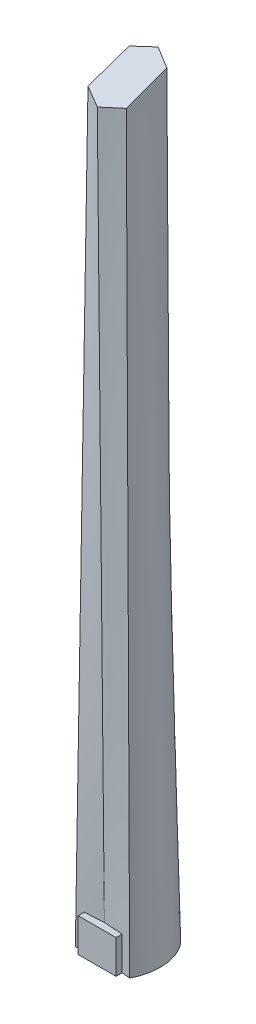
ISO-10303-21;
HEADER;
FILE_DESCRIPTION(('STEP AP214'),'2;1');
FILE_NAME('part.step','',(''),(''),'','','');
FILE_SCHEMA(('AUTOMOTIVE_DESIGN { 1 0 10303 214 1 1 1 1 }'));
ENDSEC;
DATA;
#1=APPLICATION_CONTEXT('core data for automotive mechanical design processes');
#2=APPLICATION_PROTOCOL_DEFINITION('international standard','automotive_design',2000,#1);
#3=PRODUCT_CONTEXT('',#1,'mechanical');
#4=PRODUCT('Part','Part','',(#3));
#5=PRODUCT_RELATED_PRODUCT_CATEGORY('part','',(#4));
#6=PRODUCT_DEFINITION_FORMATION('','',#4);
#7=PRODUCT_DEFINITION_CONTEXT('part definition',#1,'design');
#8=PRODUCT_DEFINITION('design','',#6,#7);
#9=PRODUCT_DEFINITION_SHAPE('','',#8);
#10=(LENGTH_UNIT() NAMED_UNIT(*) SI_UNIT(.MILLI.,.METRE.));
#11=(NAMED_UNIT(*) PLANE_ANGLE_UNIT() SI_UNIT($,.RADIAN.));
#12=(NAMED_UNIT(*) SI_UNIT($,.STERADIAN.) SOLID_ANGLE_UNIT());
#13=UNCERTAINTY_MEASURE_WITH_UNIT(LENGTH_MEASURE(1.E-05),#10,'distance_accuracy_value','');
#14=(GEOMETRIC_REPRESENTATION_CONTEXT(3) GLOBAL_UNCERTAINTY_ASSIGNED_CONTEXT((#13)) GLOBAL_UNIT_ASSIGNED_CONTEXT((#10,
#11,#12)) REPRESENTATION_CONTEXT('',''));
#15=CARTESIAN_POINT('',(0.,0.,0.));
#16=DIRECTION('',(0.,0.,1.));
#17=DIRECTION('',(1.,0.,0.));
#18=AXIS2_PLACEMENT_3D('',#15,#16,#17);
#19=CARTESIAN_POINT('',(3.5,3.1,-18.2));
#20=DIRECTION('',(0.,0.,-1.));
#21=DIRECTION('',(-1.,0.,0.));
#22=AXIS2_PLACEMENT_3D('',#19,#20,#21);
#23=PLANE('',#22);
#24=DIRECTION('',(0.,-1.,0.));
#25=VECTOR('',#24,1.);
#26=CARTESIAN_POINT('',(-3.5,3.1,-18.2));
#27=LINE('',#26,#25);
#28=CARTESIAN_POINT('',(-3.5,3.1,-18.2));
#29=VERTEX_POINT('',#28);
#30=CARTESIAN_POINT('',(-3.5,-3.1,-18.2));
#31=VERTEX_POINT('',#30);
#32=EDGE_CURVE('E226',#29,#31,#27,.T.);
#33=ORIENTED_EDGE('',*,*,#32,.T.);
#34=DIRECTION('',(-1.,0.,0.));
#35=VECTOR('',#34,1.);
#36=CARTESIAN_POINT('',(3.5,-3.1,-18.2));
#37=LINE('',#36,#35);
#38=CARTESIAN_POINT('',(3.5,-3.1,-18.2));
#39=VERTEX_POINT('',#38);
#40=EDGE_CURVE('E440',#39,#31,#37,.T.);
#41=ORIENTED_EDGE('',*,*,#40,.F.);
#42=DIRECTION('',(0.,-1.,0.));
#43=VECTOR('',#42,1.);
#44=CARTESIAN_POINT('',(3.5,3.1,-18.2));
#45=LINE('',#44,#43);
#46=CARTESIAN_POINT('',(3.5,3.1,-18.2));
#47=VERTEX_POINT('',#46);
#48=EDGE_CURVE('E227',#47,#39,#45,.T.);
#49=ORIENTED_EDGE('',*,*,#48,.F.);
#50=DIRECTION('',(-1.,0.,0.));
#51=VECTOR('',#50,1.);
#52=CARTESIAN_POINT('',(3.5,3.1,-18.2));
#53=LINE('',#52,#51);
#54=EDGE_CURVE('E442',#47,#29,#53,.T.);
#55=ORIENTED_EDGE('',*,*,#54,.T.);
#56=EDGE_LOOP('',(#33,#41,#49,#55));
#57=FACE_BOUND('',#56,.T.);
#58=ADVANCED_FACE('F57',(#57),#23,.F.);
#59=CARTESIAN_POINT('',(3.5,-3.1,-18.2));
#60=DIRECTION('',(0.,1.,0.));
#61=DIRECTION('',(0.,0.,1.));
#62=AXIS2_PLACEMENT_3D('',#59,#60,#61);
#63=PLANE('',#62);
#64=DIRECTION('',(0.,0.,-1.));
#65=VECTOR('',#64,1.);
#66=CARTESIAN_POINT('',(-3.5,-3.1,-18.2));
#67=LINE('',#66,#65);
#68=CARTESIAN_POINT('',(-3.5,-3.1,-19.321786953521));
#69=VERTEX_POINT('',#68);
#70=EDGE_CURVE('E444',#31,#69,#67,.T.);
#71=ORIENTED_EDGE('',*,*,#70,.T.);
#72=DIRECTION('',(-0.996767792058397,0.,0.0803365963619861));
#73=VECTOR('',#72,1.);
#74=CARTESIAN_POINT('',(0.,-3.1,-19.6038768138749));
#75=LINE('',#74,#73);
#76=CARTESIAN_POINT('',(-5.01105869877265,-3.1,-19.2000000000001));
#77=VERTEX_POINT('',#76);
#78=EDGE_CURVE('E285',#69,#77,#75,.T.);
#79=ORIENTED_EDGE('',*,*,#78,.T.);
#80=CARTESIAN_POINT('',(0.,-3.1,-23.7));
#81=DIRECTION('',(0.,-1.,0.));
#82=DIRECTION('',(0.,0.,-1.));
#83=AXIS2_PLACEMENT_3D('',#80,#81,#82);
#84=ELLIPSE('',#83,7.8,6.135);
#85=CARTESIAN_POINT('',(-0.5,-3.09999999999999,-31.4740523249535));
#86=VERTEX_POINT('',#85);
#87=EDGE_CURVE('E295',#77,#86,#84,.T.);
#88=ORIENTED_EDGE('',*,*,#87,.T.);
#89=DIRECTION('',(0.969708502165906,0.,-0.244265062641292));
#90=VECTOR('',#89,1.);
#91=CARTESIAN_POINT('',(0.,-3.09999999999999,-31.6));
#92=LINE('',#91,#90);
#93=CARTESIAN_POINT('',(0.,-3.09999999999999,-31.6));
#94=VERTEX_POINT('',#93);
#95=EDGE_CURVE('E298',#86,#94,#92,.T.);
#96=ORIENTED_EDGE('',*,*,#95,.T.);
#97=DIRECTION('',(0.969708502165906,0.,0.244265062641292));
#98=VECTOR('',#97,1.);
#99=CARTESIAN_POINT('',(0.5,-3.09999999999999,-31.4740523249535));
#100=LINE('',#99,#98);
#101=CARTESIAN_POINT('',(0.5,-3.09999999999999,-31.4740523249535));
#102=VERTEX_POINT('',#101);
#103=EDGE_CURVE('E287',#94,#102,#100,.T.);
#104=ORIENTED_EDGE('',*,*,#103,.T.);
#105=CARTESIAN_POINT('',(0.,-3.1,-23.7));
#106=DIRECTION('',(0.,-1.,0.));
#107=DIRECTION('',(0.,0.,-1.));
#108=AXIS2_PLACEMENT_3D('',#105,#106,#107);
#109=ELLIPSE('',#108,7.8,6.135);
#110=CARTESIAN_POINT('',(5.01105869877264,-3.1,-19.2000000000001));
#111=VERTEX_POINT('',#110);
#112=EDGE_CURVE('E273',#102,#111,#109,.T.);
#113=ORIENTED_EDGE('',*,*,#112,.T.);
#114=DIRECTION('',(-0.996767792058396,0.,-0.0803365963619911));
#115=VECTOR('',#114,1.);
#116=CARTESIAN_POINT('',(5.01105869877264,-3.1,-19.2000000000001));
#117=LINE('',#116,#115);
#118=CARTESIAN_POINT('',(3.5,-3.1,-19.321786953521));
#119=VERTEX_POINT('',#118);
#120=EDGE_CURVE('E182',#111,#119,#117,.T.);
#121=ORIENTED_EDGE('',*,*,#120,.T.);
#122=DIRECTION('',(0.,0.,-1.));
#123=VECTOR('',#122,1.);
#124=CARTESIAN_POINT('',(3.5,-3.1,-18.2));
#125=LINE('',#124,#123);
#126=EDGE_CURVE('E283',#39,#119,#125,.T.);
#127=ORIENTED_EDGE('',*,*,#126,.F.);
#128=ORIENTED_EDGE('',*,*,#40,.T.);
#129=EDGE_LOOP('',(#71,#79,#88,#96,#104,#113,#121,#127,#128));
#130=FACE_BOUND('',#129,.T.);
#131=ADVANCED_FACE('F232',(#130),#63,.F.);
#132=CARTESIAN_POINT('',(3.5,3.1,-18.2));
#133=DIRECTION('',(0.,-1.,0.));
#134=DIRECTION('',(0.,0.,-1.));
#135=AXIS2_PLACEMENT_3D('',#132,#133,#134);
#136=PLANE('',#135);
#137=CARTESIAN_POINT('',(3.5,3.1,-19.3271864966014));
#138=CARTESIAN_POINT('',(3.08184621308798,3.1,-19.3528787017063));
#139=CARTESIAN_POINT('',(2.66369242617595,3.1,-19.3785709068112));
#140=CARTESIAN_POINT('',(1.49702575950929,3.1,-19.4502532405057));
#141=CARTESIAN_POINT('',(0.748512879754643,3.1,-19.4962433690953));
#142=CARTESIAN_POINT('',(0.,3.1,-19.5422334976849));
#143=B_SPLINE_CURVE_WITH_KNOTS('',3,(#137,#138,#139,#140,#141,#142),.UNSPECIFIED.,.F.,.F.,(4,2,
4),(0.,1.25682700090671,3.50660023565205),.UNSPECIFIED.);
#144=CARTESIAN_POINT('',(3.5,3.1,-19.3271864966014));
#145=VERTEX_POINT('',#144);
#146=CARTESIAN_POINT('',(0.,3.10000000000001,-19.5422334976849));
#147=VERTEX_POINT('',#146);
#148=EDGE_CURVE('E80',#145,#147,#143,.T.);
#149=ORIENTED_EDGE('',*,*,#148,.T.);
#150=CARTESIAN_POINT('',(0.,3.10000000000001,-19.5422334976849));
#151=CARTESIAN_POINT('',(-0.418153786912024,3.1,-19.51654129258));
#152=CARTESIAN_POINT('',(-0.836307573824049,3.1,-19.4908490874751));
#153=CARTESIAN_POINT('',(-2.00297424049072,3.1,-19.4191667537806));
#154=CARTESIAN_POINT('',(-2.75148712024536,3.1,-19.373176625191));
#155=CARTESIAN_POINT('',(-3.5,3.1,-19.3271864966014));
#156=B_SPLINE_CURVE_WITH_KNOTS('',3,(#150,#151,#152,#153,#154,#155),.UNSPECIFIED.,.F.,.F.,(4,2,
4),(0.,1.25682700090672,3.50660023565205),.UNSPECIFIED.);
#157=CARTESIAN_POINT('',(-3.5,3.1,-19.3271864966014));
#158=VERTEX_POINT('',#157);
#159=EDGE_CURVE('E156',#147,#158,#156,.T.);
#160=ORIENTED_EDGE('',*,*,#159,.T.);
#161=DIRECTION('',(0.,0.,1.));
#162=VECTOR('',#161,1.);
#163=CARTESIAN_POINT('',(-3.5,3.1,-18.2));
#164=LINE('',#163,#162);
#165=EDGE_CURVE('E446',#158,#29,#164,.T.);
#166=ORIENTED_EDGE('',*,*,#165,.T.);
#167=ORIENTED_EDGE('',*,*,#54,.F.);
#168=DIRECTION('',(0.,0.,1.));
#169=VECTOR('',#168,1.);
#170=CARTESIAN_POINT('',(3.5,3.1,-18.2));
#171=LINE('',#170,#169);
#172=EDGE_CURVE('E450',#145,#47,#171,.T.);
#173=ORIENTED_EDGE('',*,*,#172,.F.);
#174=EDGE_LOOP('',(#149,#160,#166,#167,#173));
#175=FACE_BOUND('',#174,.T.);
#176=ADVANCED_FACE('F229',(#175),#136,.F.);
#177=CARTESIAN_POINT('',(3.5,0.,-23.7));
#178=DIRECTION('',(-1.,0.,0.));
#179=DIRECTION('',(0.,0.,1.));
#180=AXIS2_PLACEMENT_3D('',#177,#178,#179);
#181=PLANE('',#180);
#182=ORIENTED_EDGE('',*,*,#126,.T.);
#183=CARTESIAN_POINT('',(3.5,-3.1,-19.321786953521));
#184=CARTESIAN_POINT('',(3.5,-2.06666653696074,-19.3225379431415));
#185=CARTESIAN_POINT('',(3.5,-1.03333313877444,-19.3233633998751));
#186=CARTESIAN_POINT('',(3.5,1.03333352789223,-19.3251632475686));
#187=CARTESIAN_POINT('',(3.5,2.0666667963726,-19.3261376385284));
#188=CARTESIAN_POINT('',(3.5,3.1,-19.3271864966014));
#189=B_SPLINE_CURVE_WITH_KNOTS('',3,(#183,#184,#185,#186,#187,#188),.UNSPECIFIED.,.F.,.F.,(4,2,
4),(0.,3.10000118365696,6.20000236731393),.UNSPECIFIED.);
#190=EDGE_CURVE('E66',#119,#145,#189,.T.);
#191=ORIENTED_EDGE('',*,*,#190,.T.);
#192=ORIENTED_EDGE('',*,*,#172,.T.);
#193=ORIENTED_EDGE('',*,*,#48,.T.);
#194=EDGE_LOOP('',(#182,#191,#192,#193));
#195=FACE_BOUND('',#194,.T.);
#196=ADVANCED_FACE('F202',(#195),#181,.F.);
#197=CARTESIAN_POINT('',(-3.5,0.,-23.7));
#198=DIRECTION('',(-1.,0.,0.));
#199=DIRECTION('',(0.,0.,1.));
#200=AXIS2_PLACEMENT_3D('',#197,#198,#199);
#201=PLANE('',#200);
#202=CARTESIAN_POINT('',(-3.5,-3.1,-19.321786953521));
#203=CARTESIAN_POINT('',(-3.5,-2.06666653696074,-19.3225379431415));
#204=CARTESIAN_POINT('',(-3.5,-1.03333313877444,-19.3233633998751));
#205=CARTESIAN_POINT('',(-3.5,1.03333352789223,-19.3251632475686));
#206=CARTESIAN_POINT('',(-3.5,2.0666667963726,-19.3261376385284));
#207=CARTESIAN_POINT('',(-3.5,3.1,-19.3271864966014));
#208=B_SPLINE_CURVE_WITH_KNOTS('',3,(#202,#203,#204,#205,#206,#207),.UNSPECIFIED.,.F.,.F.,(4,2,
4),(0.,3.10000118365696,6.20000236731393),.UNSPECIFIED.);
#209=EDGE_CURVE('E456',#69,#158,#208,.T.);
#210=ORIENTED_EDGE('',*,*,#209,.F.);
#211=ORIENTED_EDGE('',*,*,#70,.F.);
#212=ORIENTED_EDGE('',*,*,#32,.F.);
#213=ORIENTED_EDGE('',*,*,#165,.F.);
#214=EDGE_LOOP('',(#210,#211,#212,#213));
#215=FACE_BOUND('',#214,.T.);
#216=ADVANCED_FACE('F197',(#215),#201,.T.);
#217=CARTESIAN_POINT('',(0.,-3.1,-19.6038768138749));
#218=CARTESIAN_POINT('',(0.,138.1,-18.2000000000001));
#219=CARTESIAN_POINT('',(0.83517644979544,-3.1,-19.5365640115624));
#220=CARTESIAN_POINT('',(0.583333333333336,138.1,-18.5125000000001));
#221=CARTESIAN_POINT('',(1.67035289959088,-3.1,-19.46925120925));
#222=CARTESIAN_POINT('',(1.16666666666667,138.1,-18.8250000000001));
#223=CARTESIAN_POINT('',(3.34070579918176,-3.1,-19.334625604625));
#224=CARTESIAN_POINT('',(2.33333333333334,138.1,-19.4500000000001));
#225=CARTESIAN_POINT('',(4.1758822489772,-3.1,-19.2673128023126));
#226=CARTESIAN_POINT('',(2.91666666666667,138.1,-19.7625000000001));
#227=CARTESIAN_POINT('',(5.01105869877264,-3.1,-19.2000000000001));
#228=CARTESIAN_POINT('',(3.5,138.1,-20.0750000000001));
#229=B_SPLINE_SURFACE_WITH_KNOTS('',3,1,((#217,#218),(#219,#220),(#221,#222),(#223,#224),(#225,
#226),(#227,#228)),.UNSPECIFIED.,.F.,.F.,.F.,(4,2,4),(2,2),(0.,0.5,1.),(0.,1.),.UNSPECIFIED.);
#230=CARTESIAN_POINT('',(0.,134.1,-18.239769881413));
#231=CARTESIAN_POINT('',(0.368528414141569,134.16696005857,-18.4274292977448));
#232=CARTESIAN_POINT('',(0.736857004116908,134.234044345406,-18.6154368709364));
#233=CARTESIAN_POINT('',(1.5106251836083,134.375311580376,-19.0113464239956));
#234=CARTESIAN_POINT('',(1.91602155819805,134.449521262535,-19.2193233275032));
#235=CARTESIAN_POINT('',(2.72632123716101,134.598245642812,-19.6361319592883));
#236=CARTESIAN_POINT('',(3.13122453906086,134.672760342451,-19.8449636918311));
#237=CARTESIAN_POINT('',(3.53587771151628,134.747428144113,-20.0542245016014));
#238=B_SPLINE_CURVE_WITH_KNOTS('',3,(#230,#231,#232,#233,#234,#235,#236,#237),.UNSPECIFIED.,.F.,
.F.,(4,2,2,4),(0.,1.25682763559584,2.64173413129077,4.02664754561933),.UNSPECIFIED.);
#239=CARTESIAN_POINT('',(0.,134.1,-18.239769881413));
#240=VERTEX_POINT('',#239);
#241=CARTESIAN_POINT('',(3.53587771151628,134.747428144113,-20.0542245016014));
#242=VERTEX_POINT('',#241);
#243=EDGE_CURVE('E137',#240,#242,#238,.T.);
#244=DIRECTION('',(0.,0.999950577305783,0.00994197896954888));
#245=VECTOR('',#244,1.);
#246=CARTESIAN_POINT('',(0.,67.5,-18.9019384069375));
#247=LINE('',#246,#245);
#248=EDGE_CURVE('E149',#147,#240,#247,.T.);
#249=DIRECTION('',(-0.0107007306874032,0.999923546509874,-0.00619641007929271));
#250=VECTOR('',#249,1.);
#251=CARTESIAN_POINT('',(4.25552934938632,67.5,-19.6375000000001));
#252=LINE('',#251,#250);
#253=EDGE_CURVE('E151',#111,#242,#252,.T.);
#254=ORIENTED_EDGE('',*,*,#243,.F.);
#255=ORIENTED_EDGE('',*,*,#248,.F.);
#256=ORIENTED_EDGE('',*,*,#148,.F.);
#257=ORIENTED_EDGE('',*,*,#190,.F.);
#258=ORIENTED_EDGE('',*,*,#120,.F.);
#259=ORIENTED_EDGE('',*,*,#253,.T.);
#260=EDGE_LOOP('',(#254,#255,#256,#257,#258,#259));
#261=FACE_BOUND('',#260,.T.);
#262=ADVANCED_FACE('F148',(#261),#229,.T.);
#263=CARTESIAN_POINT('',(-5.01105869877265,-3.1,-19.2000000000001));
#264=CARTESIAN_POINT('',(-3.5,138.1,-20.0750000000001));
#265=CARTESIAN_POINT('',(-4.17588224897721,-3.1,-19.2673128023126));
#266=CARTESIAN_POINT('',(-2.91666666666667,138.1,-19.7625000000001));
#267=CARTESIAN_POINT('',(-3.34070579918177,-3.1,-19.334625604625));
#268=CARTESIAN_POINT('',(-2.33333333333334,138.1,-19.4500000000001));
#269=CARTESIAN_POINT('',(-1.67035289959089,-3.1,-19.46925120925));
#270=CARTESIAN_POINT('',(-1.16666666666668,138.1,-18.8250000000001));
#271=CARTESIAN_POINT('',(-0.835176449795443,-3.1,-19.5365640115624));
#272=CARTESIAN_POINT('',(-0.58333333333334,138.1,-18.5125000000001));
#273=CARTESIAN_POINT('',(0.,-3.1,-19.6038768138749));
#274=CARTESIAN_POINT('',(0.,138.1,-18.2000000000001));
#275=B_SPLINE_SURFACE_WITH_KNOTS('',3,1,((#263,#264),(#265,#266),(#267,#268),(#269,#270),(#271,
#272),(#273,#274)),.UNSPECIFIED.,.F.,.F.,.F.,(4,2,4),(2,2),(0.,0.5,1.),(0.,1.),.UNSPECIFIED.);
#276=CARTESIAN_POINT('',(-3.53587771151628,134.747428144113,-20.0542245016014));
#277=CARTESIAN_POINT('',(-3.16864950578684,134.679666107722,-19.8643174962891));
#278=CARTESIAN_POINT('',(-2.8012152904957,134.612030162157,-19.6747638677712));
#279=CARTESIAN_POINT('',(-2.02847398200534,134.470129539642,-19.2770792096803));
#280=CARTESIAN_POINT('',(-1.62312317525491,134.395891746474,-19.0690235234543));
#281=CARTESIAN_POINT('',(-0.811929125169262,134.247719021931,-18.6537609385971));
#282=CARTESIAN_POINT('',(-0.406085879401792,134.173784092059,-18.4465540441806));
#283=CARTESIAN_POINT('',(0.,134.1,-18.239769881413));
#284=B_SPLINE_CURVE_WITH_KNOTS('',3,(#276,#277,#278,#279,#280,#281,#282,#283),.UNSPECIFIED.,.F.,
.F.,(4,2,2,4),(0.,1.25682765441886,2.64173416640638,4.02664754678678),.UNSPECIFIED.);
#285=CARTESIAN_POINT('',(-3.53587771151628,134.747428144113,-20.0542245016014));
#286=VERTEX_POINT('',#285);
#287=EDGE_CURVE('E134',#286,#240,#284,.T.);
#288=DIRECTION('',(0.0107007306874033,0.999923546509874,-0.00619641007929261));
#289=VECTOR('',#288,1.);
#290=CARTESIAN_POINT('',(-4.25552934938632,67.5,-19.6375000000001));
#291=LINE('',#290,#289);
#292=EDGE_CURVE('E157',#77,#286,#291,.T.);
#293=ORIENTED_EDGE('',*,*,#287,.F.);
#294=ORIENTED_EDGE('',*,*,#292,.F.);
#295=ORIENTED_EDGE('',*,*,#78,.F.);
#296=ORIENTED_EDGE('',*,*,#209,.T.);
#297=ORIENTED_EDGE('',*,*,#159,.F.);
#298=ORIENTED_EDGE('',*,*,#248,.T.);
#299=EDGE_LOOP('',(#293,#294,#295,#296,#297,#298));
#300=FACE_BOUND('',#299,.T.);
#301=ADVANCED_FACE('F154',(#300),#275,.T.);
#302=CARTESIAN_POINT('',(0.5,-3.09999999999999,-31.4740523249535));
#303=CARTESIAN_POINT('',(3.5,138.1,-27.5750000000001));
#304=CARTESIAN_POINT('',(0.416666666666665,-3.09999999999999,-31.4950436041279));
#305=CARTESIAN_POINT('',(2.91666666666667,138.1,-27.8875000000001));
#306=CARTESIAN_POINT('',(0.333333333333332,-3.09999999999999,-31.5160348833023));
#307=CARTESIAN_POINT('',(2.33333333333334,138.1,-28.2000000000001));
#308=CARTESIAN_POINT('',(0.166666666666666,-3.09999999999999,-31.5580174416512));
#309=CARTESIAN_POINT('',(1.16666666666667,138.1,-28.8250000000001));
#310=CARTESIAN_POINT('',(0.0833333333333328,-3.09999999999999,-31.5790087208256));
#311=CARTESIAN_POINT('',(0.583333333333338,138.1,-29.1375000000001));
#312=CARTESIAN_POINT('',(0.,-3.09999999999999,-31.6));
#313=CARTESIAN_POINT('',(0.,138.1,-29.4500000000001));
#314=B_SPLINE_SURFACE_WITH_KNOTS('',3,1,((#302,#303),(#304,#305),(#306,#307),(#308,#309),(#310,
#311),(#312,#313)),.UNSPECIFIED.,.F.,.F.,.F.,(4,2,4),(2,2),(0.,0.5,1.),(0.,1.),.UNSPECIFIED.);
#315=CARTESIAN_POINT('',(3.48592413410357,137.437495911808,-27.5932941792165));
#316=CARTESIAN_POINT('',(3.19540526165819,137.492689608597,-27.7479776897417));
#317=CARTESIAN_POINT('',(2.90489271193011,137.54788706409,-27.9026717342508));
#318=CARTESIAN_POINT('',(2.17862709571426,137.685890073265,-28.2894331067265));
#319=CARTESIAN_POINT('',(1.7428819110457,137.768700311642,-28.5215135638219));
#320=CARTESIAN_POINT('',(0.871419793999645,137.934337580494,-28.9857215388333));
#321=CARTESIAN_POINT('',(0.435702861622529,138.017164610969,-29.2178490567499));
#322=CARTESIAN_POINT('',(0.,138.1,-29.4500000000001));
#323=B_SPLINE_CURVE_WITH_KNOTS('',3,(#315,#316,#317,#318,#319,#320,#321,#322),.UNSPECIFIED.,.F.,
.F.,(4,2,2,4),(0.,1.00118476338147,2.50296192752349,4.00473911143994),.UNSPECIFIED.);
#324=CARTESIAN_POINT('',(3.48592413410357,137.437495911808,-27.5932941792165));
#325=VERTEX_POINT('',#324);
#326=CARTESIAN_POINT('',(0.,138.1,-29.4500000000001));
#327=VERTEX_POINT('',#326);
#328=EDGE_CURVE('E143',#325,#327,#323,.T.);
#329=DIRECTION('',(-0.021233574820975,-0.999393588240558,-0.0275969397575981));
#330=VECTOR('',#329,1.);
#331=CARTESIAN_POINT('',(2.,67.5,-29.5245261624768));
#332=LINE('',#331,#330);
#333=EDGE_CURVE('E60',#325,#102,#332,.T.);
#334=DIRECTION('',(0.,0.999884095040298,0.015224864053375));
#335=VECTOR('',#334,1.);
#336=CARTESIAN_POINT('',(0.,67.5,-30.525));
#337=LINE('',#336,#335);
#338=EDGE_CURVE('E316',#94,#327,#337,.T.);
#339=ORIENTED_EDGE('',*,*,#328,.F.);
#340=ORIENTED_EDGE('',*,*,#333,.T.);
#341=ORIENTED_EDGE('',*,*,#103,.F.);
#342=ORIENTED_EDGE('',*,*,#338,.T.);
#343=EDGE_LOOP('',(#339,#340,#341,#342));
#344=FACE_BOUND('',#343,.T.);
#345=ADVANCED_FACE('F359',(#344),#314,.T.);
#346=CARTESIAN_POINT('',(0.,-3.09999999999999,-31.6));
#347=CARTESIAN_POINT('',(0.,138.1,-29.4500000000001));
#348=CARTESIAN_POINT('',(-0.0833333333333346,-3.09999999999999,-31.5790087208256));
#349=CARTESIAN_POINT('',(-0.583333333333326,138.1,-29.1375000000001));
#350=CARTESIAN_POINT('',(-0.166666666666669,-3.09999999999999,-31.5580174416512));
#351=CARTESIAN_POINT('',(-1.16666666666666,138.1,-28.8250000000001));
#352=CARTESIAN_POINT('',(-0.333333333333336,-3.09999999999999,-31.5160348833023));
#353=CARTESIAN_POINT('',(-2.33333333333332,138.1,-28.2000000000001));
#354=CARTESIAN_POINT('',(-0.416666666666668,-3.09999999999999,-31.4950436041279));
#355=CARTESIAN_POINT('',(-2.91666666666666,138.1,-27.8875000000001));
#356=CARTESIAN_POINT('',(-0.5,-3.09999999999999,-31.4740523249535));
#357=CARTESIAN_POINT('',(-3.5,138.1,-27.5750000000001));
#358=B_SPLINE_SURFACE_WITH_KNOTS('',3,1,((#346,#347),(#348,#349),(#350,#351),(#352,#353),(#354,
#355),(#356,#357)),.UNSPECIFIED.,.F.,.F.,.F.,(4,2,4),(2,2),(0.,0.5,1.),(0.,1.),.UNSPECIFIED.);
#359=CARTESIAN_POINT('',(0.,138.1,-29.4500000000001));
#360=CARTESIAN_POINT('',(-0.580937135994762,137.989552817116,-29.1404654159803));
#361=CARTESIAN_POINT('',(-1.16189928579996,137.879120493991,-28.8309724772909));
#362=CARTESIAN_POINT('',(-2.03338024556787,137.713494429022,-28.3667959018055));
#363=CARTESIAN_POINT('',(-2.32388019107855,137.658289476734,-28.2120808470963));
#364=CARTESIAN_POINT('',(-2.90489269481088,137.547887067337,-27.9026717433489));
#365=CARTESIAN_POINT('',(-3.19540525303259,137.492689610228,-27.7479776943108));
#366=CARTESIAN_POINT('',(-3.48592413410357,137.437495911808,-27.5932941792165));
#367=B_SPLINE_CURVE_WITH_KNOTS('',3,(#359,#360,#361,#362,#363,#364,#365,#366),.UNSPECIFIED.,.F.,
.F.,(4,2,2,4),(0.,2.00236953128496,3.00355431814241,4.00473911089565),.UNSPECIFIED.);
#368=CARTESIAN_POINT('',(-3.48592413410357,137.437495911808,-27.5932941792165));
#369=VERTEX_POINT('',#368);
#370=EDGE_CURVE('E72',#327,#369,#367,.T.);
#371=DIRECTION('',(-0.021233574820975,0.999393588240558,0.0275969397575981));
#372=VECTOR('',#371,1.);
#373=CARTESIAN_POINT('',(-2.,67.5,-29.5245261624768));
#374=LINE('',#373,#372);
#375=EDGE_CURVE('E160',#86,#369,#374,.T.);
#376=ORIENTED_EDGE('',*,*,#370,.F.);
#377=ORIENTED_EDGE('',*,*,#338,.F.);
#378=ORIENTED_EDGE('',*,*,#95,.F.);
#379=ORIENTED_EDGE('',*,*,#375,.T.);
#380=EDGE_LOOP('',(#376,#377,#378,#379));
#381=FACE_BOUND('',#380,.T.);
#382=ADVANCED_FACE('F314',(#381),#358,.T.);
#383=CARTESIAN_POINT('',(5.01105869877264,-3.1,-19.2000000000001));
#384=CARTESIAN_POINT('',(3.5,138.1,-20.0750000000001));
#385=CARTESIAN_POINT('',(5.26721176144796,-3.1,-19.6610803353587));
#386=CARTESIAN_POINT('',(3.5,138.1,-20.3875000000001));
#387=CARTESIAN_POINT('',(5.500517699996,-3.1,-20.1877362540474));
#388=CARTESIAN_POINT('',(3.5,138.1,-20.7000000000001));
#389=CARTESIAN_POINT('',(5.87467943936492,-3.1,-21.3641584012241));
#390=CARTESIAN_POINT('',(3.5,138.1,-21.3250000000001));
#391=CARTESIAN_POINT('',(6.01497982950319,-3.1,-22.0142490207324));
#392=CARTESIAN_POINT('',(3.5,138.1,-21.6375000000001));
#393=CARTESIAN_POINT('',(6.15471449388442,-3.1,-23.3951203764202));
#394=CARTESIAN_POINT('',(3.5,138.1,-22.2625000000001));
#395=CARTESIAN_POINT('',(6.15339238526736,-3.1,-24.1255683204977));
#396=CARTESIAN_POINT('',(3.5,138.1,-22.5750000000001));
#397=CARTESIAN_POINT('',(5.98096052104243,-3.1,-25.5876622896784));
#398=CARTESIAN_POINT('',(3.5,138.1,-23.2000000000001));
#399=CARTESIAN_POINT('',(5.80946577633657,-3.1,-26.3182011023983));
#400=CARTESIAN_POINT('',(3.5,138.1,-23.5125000000001));
#401=CARTESIAN_POINT('',(5.3068177205364,-3.1,-27.685846471235));
#402=CARTESIAN_POINT('',(3.5,138.1,-24.1375000000001));
#403=CARTESIAN_POINT('',(4.97609244908729,-3.1,-28.3217883825639));
#404=CARTESIAN_POINT('',(3.5,138.1,-24.4500000000001));
#405=CARTESIAN_POINT('',(4.20460362021986,-3.09999999999999,-29.4279899624467));
#406=CARTESIAN_POINT('',(3.5,138.1,-25.0750000000001));
#407=CARTESIAN_POINT('',(3.76475506907411,-3.1,-29.8979147299094));
#408=CARTESIAN_POINT('',(3.5,138.1,-25.3875000000001));
#409=CARTESIAN_POINT('',(2.84199229706693,-3.09999999999999,-30.6475694007451));
#410=CARTESIAN_POINT('',(3.5,138.1,-26.0125000000001));
#411=CARTESIAN_POINT('',(2.35976413219818,-3.09999999999999,-30.9278234472326));
#412=CARTESIAN_POINT('',(3.5,138.1,-26.3250000000001));
#413=CARTESIAN_POINT('',(1.40994848446077,-3.09999999999999,-31.3176868804898));
#414=CARTESIAN_POINT('',(3.5,138.1,-26.9500000000001));
#415=CARTESIAN_POINT('',(0.942521624985577,-3.09999999999999,-31.4280460453352));
#416=CARTESIAN_POINT('',(3.5,138.1,-27.2625000000001));
#417=CARTESIAN_POINT('',(0.499999999999998,-3.09999999999999,-31.4740523249535));
#418=CARTESIAN_POINT('',(3.5,138.1,-27.5750000000001));
#419=B_SPLINE_SURFACE_WITH_KNOTS('',3,1,((#383,#384),(#385,#386),(#387,#388),(#389,#390),(#391,
#392),(#393,#394),(#395,#396),(#397,#398),(#399,#400),(#401,#402),(#403,#404),(#405,#406),(#407,
#408),(#409,#410),(#411,#412),(#413,#414),(#415,#416),(#417,#418)),.UNSPECIFIED.,.F.,.F.,.F.,(4,
2,2,2,2,2,2,2,4),(2,2),(0.,0.125,0.25,0.375,0.5,0.625,0.75,0.875,1.),(0.,1.),.UNSPECIFIED.);
#420=CARTESIAN_POINT('',(3.53587771151628,134.747428144113,-20.0542245016014));
#421=CARTESIAN_POINT('',(3.53885394271208,134.816246294752,-20.2470913278531));
#422=CARTESIAN_POINT('',(3.5413737798236,134.885066840999,-20.43996486793));
#423=CARTESIAN_POINT('',(3.54541089213693,135.022711349252,-20.82572152095));
#424=CARTESIAN_POINT('',(3.5469281655999,135.091535311265,-21.0186046339091));
#425=CARTESIAN_POINT('',(3.54887024429726,135.229176416511,-21.4043517498043));
#426=CARTESIAN_POINT('',(3.54929518634026,135.297993559518,-21.5972157521081));
#427=CARTESIAN_POINT('',(3.54903173577272,135.435627473957,-21.9829427153556));
#428=CARTESIAN_POINT('',(3.54834334487081,135.50444424539,-22.1758056763004));
#429=CARTESIAN_POINT('',(3.54593521762637,135.642076228548,-22.5615272270206));
#430=CARTESIAN_POINT('',(3.54421547312014,135.710891440257,-22.7543858167493));
#431=CARTESIAN_POINT('',(3.53990592285794,135.848518813625,-23.1400944482682));
#432=CARTESIAN_POINT('',(3.53731611540218,135.917330975279,-23.3329444900409));
#433=CARTESIAN_POINT('',(3.53155226101193,136.054954970722,-23.7186436547315));
#434=CARTESIAN_POINT('',(3.52837819252378,136.123766804407,-23.911492777353));
#435=CARTESIAN_POINT('',(3.52178183660672,136.261389193374,-24.2971874398003));
#436=CARTESIAN_POINT('',(3.51835954875494,136.330199748654,-24.4900329796195));
#437=CARTESIAN_POINT('',(3.51077395582181,136.485545573917,-24.9253985919099));
#438=CARTESIAN_POINT('',(3.50664683473051,136.57208105533,-25.1679192569246));
#439=CARTESIAN_POINT('',(3.49924324856312,136.745155835149,-25.6529712842982));
#440=CARTESIAN_POINT('',(3.49596677849985,136.83169513353,-25.895502646586));
#441=CARTESIAN_POINT('',(3.49071460307646,137.004775893894,-26.3805714347814));
#442=CARTESIAN_POINT('',(3.48873886053996,137.091317355744,-26.6231088603177));
#443=CARTESIAN_POINT('',(3.48622198128335,137.264404517047,-27.1081955875102));
#444=CARTESIAN_POINT('',(3.48568087644758,137.35095021655,-27.3507448893107));
#445=CARTESIAN_POINT('',(3.48592413410357,137.437495911808,-27.5932941792165));
#446=B_SPLINE_CURVE_WITH_KNOTS('',3,(#420,#421,#422,#423,#424,#425,#426,#427,#428,#429,#430,
#431,#432,#433,#434,#435,#436,#437,#438,#439,#440,#441,#442,#443,#444,#445),.UNSPECIFIED.,.F.,
.F.,(4,2,2,2,2,2,2,2,2,2,2,2,4),(0.,0.614395611428044,1.2287922884616,1.8431120118826,
2.45743079250699,3.07175443584865,3.6860792793598,4.30042679012603,4.91477534750855,
5.68736486920417,6.45994986128755,7.23251277099577,8.00509285051149),.UNSPECIFIED.);
#447=EDGE_CURVE('E152',#242,#325,#446,.T.);
#448=ORIENTED_EDGE('',*,*,#447,.F.);
#449=ORIENTED_EDGE('',*,*,#253,.F.);
#450=ORIENTED_EDGE('',*,*,#112,.F.);
#451=ORIENTED_EDGE('',*,*,#333,.F.);
#452=EDGE_LOOP('',(#448,#449,#450,#451));
#453=FACE_BOUND('',#452,.T.);
#454=ADVANCED_FACE('F341',(#453),#419,.T.);
#455=CARTESIAN_POINT('',(-0.500000000000001,-3.09999999999999,-31.4740523249535));
#456=CARTESIAN_POINT('',(-3.5,138.1,-27.5750000000001));
#457=CARTESIAN_POINT('',(-0.942521624985577,-3.09999999999999,-31.4280460453352));
#458=CARTESIAN_POINT('',(-3.5,138.1,-27.2625000000001));
#459=CARTESIAN_POINT('',(-1.40994848446077,-3.1,-31.3176868804898));
#460=CARTESIAN_POINT('',(-3.5,138.1,-26.9500000000001));
#461=CARTESIAN_POINT('',(-2.35976413219817,-3.09999999999999,-30.9278234472326));
#462=CARTESIAN_POINT('',(-3.5,138.1,-26.3250000000001));
#463=CARTESIAN_POINT('',(-2.84199229706693,-3.09999999999999,-30.6475694007451));
#464=CARTESIAN_POINT('',(-3.5,138.1,-26.0125000000001));
#465=CARTESIAN_POINT('',(-3.76475506907411,-3.09999999999999,-29.8979147299094));
#466=CARTESIAN_POINT('',(-3.5,138.1,-25.3875000000001));
#467=CARTESIAN_POINT('',(-4.20460362021986,-3.09999999999999,-29.4279899624467));
#468=CARTESIAN_POINT('',(-3.5,138.1,-25.0750000000001));
#469=CARTESIAN_POINT('',(-4.97609244908728,-3.1,-28.3217883825639));
#470=CARTESIAN_POINT('',(-3.5,138.1,-24.4500000000001));
#471=CARTESIAN_POINT('',(-5.3068177205364,-3.1,-27.685846471235));
#472=CARTESIAN_POINT('',(-3.5,138.1,-24.1375000000001));
#473=CARTESIAN_POINT('',(-5.80946577633656,-3.1,-26.3182011023983));
#474=CARTESIAN_POINT('',(-3.5,138.1,-23.5125000000001));
#475=CARTESIAN_POINT('',(-5.98096052104242,-3.1,-25.5876622896784));
#476=CARTESIAN_POINT('',(-3.5,138.1,-23.2000000000001));
#477=CARTESIAN_POINT('',(-6.15339238526736,-3.1,-24.1255683204977));
#478=CARTESIAN_POINT('',(-3.5,138.1,-22.5750000000001));
#479=CARTESIAN_POINT('',(-6.15471449388442,-3.1,-23.3951203764202));
#480=CARTESIAN_POINT('',(-3.5,138.1,-22.2625000000001));
#481=CARTESIAN_POINT('',(-6.0149798295032,-3.1,-22.0142490207324));
#482=CARTESIAN_POINT('',(-3.5,138.1,-21.6375000000001));
#483=CARTESIAN_POINT('',(-5.87467943936493,-3.1,-21.3641584012242));
#484=CARTESIAN_POINT('',(-3.5,138.1,-21.3250000000001));
#485=CARTESIAN_POINT('',(-5.50051769999601,-3.1,-20.1877362540474));
#486=CARTESIAN_POINT('',(-3.5,138.1,-20.7000000000001));
#487=CARTESIAN_POINT('',(-5.26721176144797,-3.1,-19.6610803353587));
#488=CARTESIAN_POINT('',(-3.5,138.1,-20.3875000000001));
#489=CARTESIAN_POINT('',(-5.01105869877265,-3.1,-19.2000000000001));
#490=CARTESIAN_POINT('',(-3.5,138.1,-20.0750000000001));
#491=B_SPLINE_SURFACE_WITH_KNOTS('',3,1,((#455,#456),(#457,#458),(#459,#460),(#461,#462),(#463,
#464),(#465,#466),(#467,#468),(#469,#470),(#471,#472),(#473,#474),(#475,#476),(#477,#478),(#479,
#480),(#481,#482),(#483,#484),(#485,#486),(#487,#488),(#489,#490)),.UNSPECIFIED.,.F.,.F.,.F.,(4,
2,2,2,2,2,2,2,4),(2,2),(0.,0.125,0.25,0.375,0.5,0.625,0.75,0.875,1.),(0.,1.),.UNSPECIFIED.);
#492=CARTESIAN_POINT('',(-3.48592413410357,137.437495911808,-27.5932941792165));
#493=CARTESIAN_POINT('',(-3.48575171349363,137.369793189625,-27.4035534053844));
#494=CARTESIAN_POINT('',(-3.4860388045472,137.302090371302,-27.2138123621149));
#495=CARTESIAN_POINT('',(-3.48750074637622,137.16668634405,-26.8343347859945));
#496=CARTESIAN_POINT('',(-3.48867559014196,137.098985135112,-26.6445982531198));
#497=CARTESIAN_POINT('',(-3.49188174742046,136.963586099437,-26.265134666182));
#498=CARTESIAN_POINT('',(-3.49391304777186,136.895888272664,-26.075407612018));
#499=CARTESIAN_POINT('',(-3.4986821845984,136.76049536064,-25.6959611869661));
#500=CARTESIAN_POINT('',(-3.50142002227885,136.692800275395,-25.5062418160918));
#501=CARTESIAN_POINT('',(-3.51035625757238,136.489722538061,-24.9371047742232));
#502=CARTESIAN_POINT('',(-3.51727748600645,136.354343756676,-24.5576979510965));
#503=CARTESIAN_POINT('',(-3.53033970778978,136.08358396161,-23.798878048711));
#504=CARTESIAN_POINT('',(-3.53648071659221,135.948202948028,-23.4194649697249));
#505=CARTESIAN_POINT('',(-3.54394732220467,135.724042674657,-22.7912429077412));
#506=CARTESIAN_POINT('',(-3.54620289969552,135.635267215454,-22.5424445761033));
#507=CARTESIAN_POINT('',(-3.54896172312213,135.457713078009,-22.0448388912875));
#508=CARTESIAN_POINT('',(-3.54946496914936,135.368934399768,-21.7960315381101));
#509=CARTESIAN_POINT('',(-3.54860504435862,135.191365022373,-21.2983831424571));
#510=CARTESIAN_POINT('',(-3.5472415977804,135.102574323381,-21.0495421004351));
#511=CARTESIAN_POINT('',(-3.54280382137053,134.924997056127,-20.5518715929979));
#512=CARTESIAN_POINT('',(-3.53972947917775,134.836210487899,-20.3030421276795));
#513=CARTESIAN_POINT('',(-3.53587771151628,134.747428144113,-20.0542245016014));
#514=B_SPLINE_CURVE_WITH_KNOTS('',3,(#492,#493,#494,#495,#496,#497,#498,#499,#500,#501,#502,
#503,#504,#505,#506,#507,#508,#509,#510,#511,#512,#513),.UNSPECIFIED.,.F.,.F.,(4,2,2,2,2,2,2,2,
2,2,4),(0.,0.604372775995862,1.20874077991299,1.81309949670984,2.41745924451656,
3.62614617651829,4.83480916533027,5.627319584832,6.41982996297272,7.21245742864514,
8.00509062107853),.UNSPECIFIED.);
#515=EDGE_CURVE('E12',#369,#286,#514,.T.);
#516=ORIENTED_EDGE('',*,*,#515,.F.);
#517=ORIENTED_EDGE('',*,*,#375,.F.);
#518=ORIENTED_EDGE('',*,*,#87,.F.);
#519=ORIENTED_EDGE('',*,*,#292,.T.);
#520=EDGE_LOOP('',(#516,#517,#518,#519));
#521=FACE_BOUND('',#520,.T.);
#522=ADVANCED_FACE('F320',(#521),#491,.T.);
#523=CARTESIAN_POINT('',(-5.,138.1,-29.4500000000001));
#524=DIRECTION('',(0.,-0.941839100075338,-0.336064145021866));
#525=DIRECTION('',(0.,0.336064145021866,-0.941839100075338));
#526=AXIS2_PLACEMENT_3D('',#523,#524,#525);
#527=PLANE('',#526);
#528=ORIENTED_EDGE('',*,*,#447,.T.);
#529=ORIENTED_EDGE('',*,*,#328,.T.);
#530=ORIENTED_EDGE('',*,*,#370,.T.);
#531=ORIENTED_EDGE('',*,*,#515,.T.);
#532=ORIENTED_EDGE('',*,*,#287,.T.);
#533=ORIENTED_EDGE('',*,*,#243,.T.);
#534=EDGE_LOOP('',(#528,#529,#530,#531,#532,#533));
#535=FACE_BOUND('',#534,.T.);
#536=ADVANCED_FACE('F136',(#535),#527,.F.);
#537=CLOSED_SHELL('',(#58,#131,#176,#196,#216,#262,#301,#345,#382,#454,#522,#536));
#538=MANIFOLD_SOLID_BREP('B2',#537);
#539=ADVANCED_BREP_SHAPE_REPRESENTATION('',(#18,#538),#14);
#540=SHAPE_DEFINITION_REPRESENTATION(#9,#539);
ENDSEC;
END-ISO-10303-21;
